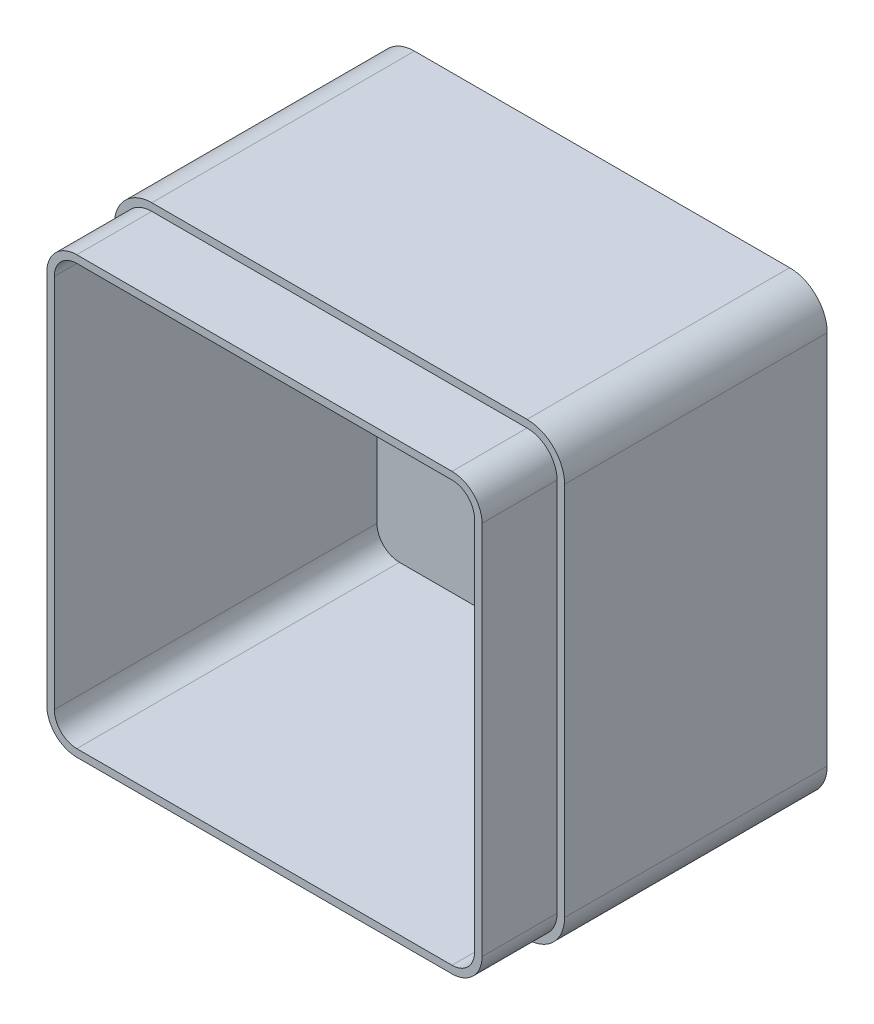
ISO-10303-21;
HEADER;
FILE_DESCRIPTION(('STEP AP214'),'2;1');
FILE_NAME('part.step','',(''),(''),'','','');
FILE_SCHEMA(('AUTOMOTIVE_DESIGN { 1 0 10303 214 1 1 1 1 }'));
ENDSEC;
DATA;
#1=APPLICATION_CONTEXT('core data for automotive mechanical design processes');
#2=APPLICATION_PROTOCOL_DEFINITION('international standard','automotive_design',2000,#1);
#3=PRODUCT_CONTEXT('',#1,'mechanical');
#4=PRODUCT('Part','Part','',(#3));
#5=PRODUCT_RELATED_PRODUCT_CATEGORY('part','',(#4));
#6=PRODUCT_DEFINITION_FORMATION('','',#4);
#7=PRODUCT_DEFINITION_CONTEXT('part definition',#1,'design');
#8=PRODUCT_DEFINITION('design','',#6,#7);
#9=PRODUCT_DEFINITION_SHAPE('','',#8);
#10=(LENGTH_UNIT() NAMED_UNIT(*) SI_UNIT(.MILLI.,.METRE.));
#11=(NAMED_UNIT(*) PLANE_ANGLE_UNIT() SI_UNIT($,.RADIAN.));
#12=(NAMED_UNIT(*) SI_UNIT($,.STERADIAN.) SOLID_ANGLE_UNIT());
#13=UNCERTAINTY_MEASURE_WITH_UNIT(LENGTH_MEASURE(1.E-05),#10,'distance_accuracy_value','');
#14=(GEOMETRIC_REPRESENTATION_CONTEXT(3) GLOBAL_UNCERTAINTY_ASSIGNED_CONTEXT((#13)) GLOBAL_UNIT_ASSIGNED_CONTEXT((#10,
#11,#12)) REPRESENTATION_CONTEXT('',''));
#15=CARTESIAN_POINT('',(0.,0.,0.));
#16=DIRECTION('',(0.,0.,1.));
#17=DIRECTION('',(1.,0.,0.));
#18=AXIS2_PLACEMENT_3D('',#15,#16,#17);
#19=CARTESIAN_POINT('',(0.,120.,90.));
#20=DIRECTION('',(0.,0.,-1.));
#21=DIRECTION('',(-1.,0.,0.));
#22=AXIS2_PLACEMENT_3D('',#19,#20,#21);
#23=PLANE('',#22);
#24=DIRECTION('',(0.,-1.,0.));
#25=VECTOR('',#24,1.);
#26=CARTESIAN_POINT('',(4.,120.,90.));
#27=LINE('',#26,#25);
#28=CARTESIAN_POINT('',(4.,110.,90.));
#29=VERTEX_POINT('',#28);
#30=CARTESIAN_POINT('',(4.,9.99999999999999,90.));
#31=VERTEX_POINT('',#30);
#32=EDGE_CURVE('E302',#29,#31,#27,.T.);
#33=ORIENTED_EDGE('',*,*,#32,.F.);
#34=CARTESIAN_POINT('',(10.,110.,90.));
#35=DIRECTION('',(0.,0.,-1.));
#36=DIRECTION('',(-1.,0.,0.));
#37=AXIS2_PLACEMENT_3D('',#34,#35,#36);
#38=CIRCLE('',#37,6.);
#39=CARTESIAN_POINT('',(9.99999999999999,116.,90.));
#40=VERTEX_POINT('',#39);
#41=EDGE_CURVE('E335',#40,#29,#38,.F.);
#42=ORIENTED_EDGE('',*,*,#41,.F.);
#43=DIRECTION('',(-1.,0.,0.));
#44=VECTOR('',#43,1.);
#45=CARTESIAN_POINT('',(0.,116.,90.));
#46=LINE('',#45,#44);
#47=CARTESIAN_POINT('',(110.,116.,90.));
#48=VERTEX_POINT('',#47);
#49=EDGE_CURVE('E312',#48,#40,#46,.T.);
#50=ORIENTED_EDGE('',*,*,#49,.F.);
#51=CARTESIAN_POINT('',(110.,110.,90.));
#52=DIRECTION('',(0.,0.,-1.));
#53=DIRECTION('',(-1.,0.,0.));
#54=AXIS2_PLACEMENT_3D('',#51,#52,#53);
#55=CIRCLE('',#54,6.);
#56=CARTESIAN_POINT('',(116.,110.,90.));
#57=VERTEX_POINT('',#56);
#58=EDGE_CURVE('E286',#57,#48,#55,.F.);
#59=ORIENTED_EDGE('',*,*,#58,.F.);
#60=DIRECTION('',(0.,1.,0.));
#61=VECTOR('',#60,1.);
#62=CARTESIAN_POINT('',(116.,120.,90.));
#63=LINE('',#62,#61);
#64=CARTESIAN_POINT('',(116.,9.99999999999999,90.));
#65=VERTEX_POINT('',#64);
#66=EDGE_CURVE('E333',#65,#57,#63,.T.);
#67=ORIENTED_EDGE('',*,*,#66,.F.);
#68=CARTESIAN_POINT('',(110.,10.,90.));
#69=DIRECTION('',(0.,0.,-1.));
#70=DIRECTION('',(-1.,0.,0.));
#71=AXIS2_PLACEMENT_3D('',#68,#69,#70);
#72=CIRCLE('',#71,6.);
#73=CARTESIAN_POINT('',(110.,4.,90.));
#74=VERTEX_POINT('',#73);
#75=EDGE_CURVE('E330',#74,#65,#72,.F.);
#76=ORIENTED_EDGE('',*,*,#75,.F.);
#77=DIRECTION('',(1.,0.,0.));
#78=VECTOR('',#77,1.);
#79=CARTESIAN_POINT('',(0.,4.,90.));
#80=LINE('',#79,#78);
#81=CARTESIAN_POINT('',(9.99999999999999,4.,90.));
#82=VERTEX_POINT('',#81);
#83=EDGE_CURVE('E328',#82,#74,#80,.T.);
#84=ORIENTED_EDGE('',*,*,#83,.F.);
#85=CARTESIAN_POINT('',(10.,10.,90.));
#86=DIRECTION('',(0.,0.,-1.));
#87=DIRECTION('',(-1.,0.,0.));
#88=AXIS2_PLACEMENT_3D('',#85,#86,#87);
#89=CIRCLE('',#88,6.);
#90=EDGE_CURVE('E319',#31,#82,#89,.F.);
#91=ORIENTED_EDGE('',*,*,#90,.F.);
#92=EDGE_LOOP('',(#33,#42,#50,#59,#67,#76,#84,#91));
#93=FACE_BOUND('',#92,.T.);
#94=CARTESIAN_POINT('',(110.,110.,90.));
#95=DIRECTION('',(0.,0.,1.));
#96=DIRECTION('',(1.,0.,0.));
#97=AXIS2_PLACEMENT_3D('',#94,#95,#96);
#98=CIRCLE('',#97,8.);
#99=CARTESIAN_POINT('',(118.,110.,90.));
#100=VERTEX_POINT('',#99);
#101=CARTESIAN_POINT('',(110.,118.,90.));
#102=VERTEX_POINT('',#101);
#103=EDGE_CURVE('E238',#100,#102,#98,.T.);
#104=ORIENTED_EDGE('',*,*,#103,.T.);
#105=DIRECTION('',(-1.,0.,0.));
#106=VECTOR('',#105,1.);
#107=CARTESIAN_POINT('',(110.,118.,90.));
#108=LINE('',#107,#106);
#109=CARTESIAN_POINT('',(9.99999999999999,118.,90.));
#110=VERTEX_POINT('',#109);
#111=EDGE_CURVE('E198',#102,#110,#108,.T.);
#112=ORIENTED_EDGE('',*,*,#111,.T.);
#113=CARTESIAN_POINT('',(10.,110.,90.));
#114=DIRECTION('',(0.,0.,1.));
#115=DIRECTION('',(1.,0.,0.));
#116=AXIS2_PLACEMENT_3D('',#113,#114,#115);
#117=CIRCLE('',#116,7.99999999999999);
#118=CARTESIAN_POINT('',(2.,110.,90.));
#119=VERTEX_POINT('',#118);
#120=EDGE_CURVE('E46',#110,#119,#117,.T.);
#121=ORIENTED_EDGE('',*,*,#120,.T.);
#122=DIRECTION('',(0.,-1.,0.));
#123=VECTOR('',#122,1.);
#124=CARTESIAN_POINT('',(2.,110.,90.));
#125=LINE('',#124,#123);
#126=CARTESIAN_POINT('',(2.00000000000001,9.99999999999999,90.));
#127=VERTEX_POINT('',#126);
#128=EDGE_CURVE('E242',#119,#127,#125,.T.);
#129=ORIENTED_EDGE('',*,*,#128,.T.);
#130=CARTESIAN_POINT('',(10.,10.,90.));
#131=DIRECTION('',(0.,0.,1.));
#132=DIRECTION('',(1.,0.,0.));
#133=AXIS2_PLACEMENT_3D('',#130,#131,#132);
#134=CIRCLE('',#133,7.99999999999999);
#135=CARTESIAN_POINT('',(9.99999999999999,2.00000000000001,90.));
#136=VERTEX_POINT('',#135);
#137=EDGE_CURVE('E245',#127,#136,#134,.T.);
#138=ORIENTED_EDGE('',*,*,#137,.T.);
#139=DIRECTION('',(1.,0.,0.));
#140=VECTOR('',#139,1.);
#141=CARTESIAN_POINT('',(9.99999999999999,2.,90.));
#142=LINE('',#141,#140);
#143=CARTESIAN_POINT('',(110.,2.00000000000001,90.));
#144=VERTEX_POINT('',#143);
#145=EDGE_CURVE('E248',#136,#144,#142,.T.);
#146=ORIENTED_EDGE('',*,*,#145,.T.);
#147=CARTESIAN_POINT('',(110.,10.,90.));
#148=DIRECTION('',(0.,0.,1.));
#149=DIRECTION('',(1.,0.,0.));
#150=AXIS2_PLACEMENT_3D('',#147,#148,#149);
#151=CIRCLE('',#150,7.99999999999999);
#152=CARTESIAN_POINT('',(118.,10.,90.));
#153=VERTEX_POINT('',#152);
#154=EDGE_CURVE('E221',#144,#153,#151,.T.);
#155=ORIENTED_EDGE('',*,*,#154,.T.);
#156=DIRECTION('',(0.,1.,0.));
#157=VECTOR('',#156,1.);
#158=CARTESIAN_POINT('',(118.,9.99999999999999,90.));
#159=LINE('',#158,#157);
#160=EDGE_CURVE('E218',#153,#100,#159,.T.);
#161=ORIENTED_EDGE('',*,*,#160,.T.);
#162=EDGE_LOOP('',(#104,#112,#121,#129,#138,#146,#155,#161));
#163=FACE_BOUND('',#162,.T.);
#164=ADVANCED_FACE('F31',(#93,#163),#23,.F.);
#165=CARTESIAN_POINT('',(4.,0.,90.));
#166=DIRECTION('',(1.,0.,0.));
#167=DIRECTION('',(0.,0.,-1.));
#168=AXIS2_PLACEMENT_3D('',#165,#166,#167);
#169=PLANE('',#168);
#170=DIRECTION('',(0.,-1.,0.));
#171=VECTOR('',#170,1.);
#172=CARTESIAN_POINT('',(4.,120.,4.));
#173=LINE('',#172,#171);
#174=CARTESIAN_POINT('',(4.,110.,4.));
#175=VERTEX_POINT('',#174);
#176=CARTESIAN_POINT('',(4.,9.99999999999999,4.));
#177=VERTEX_POINT('',#176);
#178=EDGE_CURVE('E280',#175,#177,#173,.T.);
#179=ORIENTED_EDGE('',*,*,#178,.F.);
#180=DIRECTION('',(0.,0.,-1.));
#181=VECTOR('',#180,1.);
#182=CARTESIAN_POINT('',(4.,110.,90.));
#183=LINE('',#182,#181);
#184=EDGE_CURVE('E287',#29,#175,#183,.T.);
#185=ORIENTED_EDGE('',*,*,#184,.F.);
#186=ORIENTED_EDGE('',*,*,#32,.T.);
#187=DIRECTION('',(0.,0.,-1.));
#188=VECTOR('',#187,1.);
#189=CARTESIAN_POINT('',(4.,9.99999999999999,90.));
#190=LINE('',#189,#188);
#191=EDGE_CURVE('E284',#177,#31,#190,.F.);
#192=ORIENTED_EDGE('',*,*,#191,.F.);
#193=EDGE_LOOP('',(#179,#185,#186,#192));
#194=FACE_BOUND('',#193,.T.);
#195=ADVANCED_FACE('F424',(#194),#169,.T.);
#196=CARTESIAN_POINT('',(0.,4.,90.));
#197=DIRECTION('',(0.,1.,0.));
#198=DIRECTION('',(0.,0.,1.));
#199=AXIS2_PLACEMENT_3D('',#196,#197,#198);
#200=PLANE('',#199);
#201=ORIENTED_EDGE('',*,*,#83,.T.);
#202=DIRECTION('',(0.,0.,1.));
#203=VECTOR('',#202,1.);
#204=CARTESIAN_POINT('',(110.,4.,90.));
#205=LINE('',#204,#203);
#206=CARTESIAN_POINT('',(110.,4.,4.));
#207=VERTEX_POINT('',#206);
#208=EDGE_CURVE('E310',#207,#74,#205,.T.);
#209=ORIENTED_EDGE('',*,*,#208,.F.);
#210=DIRECTION('',(1.,0.,0.));
#211=VECTOR('',#210,1.);
#212=CARTESIAN_POINT('',(0.,4.,4.));
#213=LINE('',#212,#211);
#214=CARTESIAN_POINT('',(9.99999999999999,4.,4.));
#215=VERTEX_POINT('',#214);
#216=EDGE_CURVE('E283',#215,#207,#213,.T.);
#217=ORIENTED_EDGE('',*,*,#216,.F.);
#218=DIRECTION('',(0.,0.,1.));
#219=VECTOR('',#218,1.);
#220=CARTESIAN_POINT('',(9.99999999999999,4.,90.));
#221=LINE('',#220,#219);
#222=EDGE_CURVE('E304',#82,#215,#221,.F.);
#223=ORIENTED_EDGE('',*,*,#222,.F.);
#224=EDGE_LOOP('',(#201,#209,#217,#223));
#225=FACE_BOUND('',#224,.T.);
#226=ADVANCED_FACE('F430',(#225),#200,.T.);
#227=CARTESIAN_POINT('',(116.,0.,90.));
#228=DIRECTION('',(-1.,0.,0.));
#229=DIRECTION('',(0.,0.,1.));
#230=AXIS2_PLACEMENT_3D('',#227,#228,#229);
#231=PLANE('',#230);
#232=ORIENTED_EDGE('',*,*,#66,.T.);
#233=DIRECTION('',(0.,0.,1.));
#234=VECTOR('',#233,1.);
#235=CARTESIAN_POINT('',(116.,110.,90.));
#236=LINE('',#235,#234);
#237=CARTESIAN_POINT('',(116.,110.,4.));
#238=VERTEX_POINT('',#237);
#239=EDGE_CURVE('E317',#238,#57,#236,.T.);
#240=ORIENTED_EDGE('',*,*,#239,.F.);
#241=DIRECTION('',(0.,1.,0.));
#242=VECTOR('',#241,1.);
#243=CARTESIAN_POINT('',(116.,120.,4.));
#244=LINE('',#243,#242);
#245=CARTESIAN_POINT('',(116.,9.99999999999999,4.));
#246=VERTEX_POINT('',#245);
#247=EDGE_CURVE('E293',#246,#238,#244,.T.);
#248=ORIENTED_EDGE('',*,*,#247,.F.);
#249=DIRECTION('',(0.,0.,1.));
#250=VECTOR('',#249,1.);
#251=CARTESIAN_POINT('',(116.,9.99999999999999,90.));
#252=LINE('',#251,#250);
#253=EDGE_CURVE('E313',#65,#246,#252,.F.);
#254=ORIENTED_EDGE('',*,*,#253,.F.);
#255=EDGE_LOOP('',(#232,#240,#248,#254));
#256=FACE_BOUND('',#255,.T.);
#257=ADVANCED_FACE('F620',(#256),#231,.T.);
#258=CARTESIAN_POINT('',(0.,116.,90.));
#259=DIRECTION('',(0.,-1.,0.));
#260=DIRECTION('',(0.,0.,-1.));
#261=AXIS2_PLACEMENT_3D('',#258,#259,#260);
#262=PLANE('',#261);
#263=DIRECTION('',(-1.,0.,0.));
#264=VECTOR('',#263,1.);
#265=CARTESIAN_POINT('',(0.,116.,4.));
#266=LINE('',#265,#264);
#267=CARTESIAN_POINT('',(110.,116.,4.));
#268=VERTEX_POINT('',#267);
#269=CARTESIAN_POINT('',(9.99999999999999,116.,4.));
#270=VERTEX_POINT('',#269);
#271=EDGE_CURVE('E299',#268,#270,#266,.T.);
#272=ORIENTED_EDGE('',*,*,#271,.F.);
#273=DIRECTION('',(0.,0.,-1.));
#274=VECTOR('',#273,1.);
#275=CARTESIAN_POINT('',(110.,116.,90.));
#276=LINE('',#275,#274);
#277=EDGE_CURVE('E316',#48,#268,#276,.T.);
#278=ORIENTED_EDGE('',*,*,#277,.F.);
#279=ORIENTED_EDGE('',*,*,#49,.T.);
#280=DIRECTION('',(0.,0.,-1.));
#281=VECTOR('',#280,1.);
#282=CARTESIAN_POINT('',(9.99999999999999,116.,90.));
#283=LINE('',#282,#281);
#284=EDGE_CURVE('E322',#270,#40,#283,.F.);
#285=ORIENTED_EDGE('',*,*,#284,.F.);
#286=EDGE_LOOP('',(#272,#278,#279,#285));
#287=FACE_BOUND('',#286,.T.);
#288=ADVANCED_FACE('F611',(#287),#262,.T.);
#289=CARTESIAN_POINT('',(0.,120.,4.));
#290=DIRECTION('',(0.,0.,-1.));
#291=DIRECTION('',(-1.,0.,0.));
#292=AXIS2_PLACEMENT_3D('',#289,#290,#291);
#293=PLANE('',#292);
#294=ORIENTED_EDGE('',*,*,#216,.T.);
#295=CARTESIAN_POINT('',(110.,10.,4.));
#296=DIRECTION('',(0.,0.,-1.));
#297=DIRECTION('',(-1.,0.,0.));
#298=AXIS2_PLACEMENT_3D('',#295,#296,#297);
#299=CIRCLE('',#298,6.);
#300=EDGE_CURVE('E295',#246,#207,#299,.T.);
#301=ORIENTED_EDGE('',*,*,#300,.F.);
#302=ORIENTED_EDGE('',*,*,#247,.T.);
#303=CARTESIAN_POINT('',(110.,110.,4.));
#304=DIRECTION('',(0.,0.,-1.));
#305=DIRECTION('',(-1.,0.,0.));
#306=AXIS2_PLACEMENT_3D('',#303,#304,#305);
#307=CIRCLE('',#306,6.);
#308=EDGE_CURVE('E298',#268,#238,#307,.T.);
#309=ORIENTED_EDGE('',*,*,#308,.F.);
#310=ORIENTED_EDGE('',*,*,#271,.T.);
#311=CARTESIAN_POINT('',(10.,110.,4.));
#312=DIRECTION('',(0.,0.,-1.));
#313=DIRECTION('',(-1.,0.,0.));
#314=AXIS2_PLACEMENT_3D('',#311,#312,#313);
#315=CIRCLE('',#314,6.);
#316=EDGE_CURVE('E296',#175,#270,#315,.T.);
#317=ORIENTED_EDGE('',*,*,#316,.F.);
#318=ORIENTED_EDGE('',*,*,#178,.T.);
#319=CARTESIAN_POINT('',(10.,10.,4.));
#320=DIRECTION('',(0.,0.,-1.));
#321=DIRECTION('',(-1.,0.,0.));
#322=AXIS2_PLACEMENT_3D('',#319,#320,#321);
#323=CIRCLE('',#322,6.);
#324=EDGE_CURVE('E290',#215,#177,#323,.T.);
#325=ORIENTED_EDGE('',*,*,#324,.F.);
#326=EDGE_LOOP('',(#294,#301,#302,#309,#310,#317,#318,#325));
#327=FACE_BOUND('',#326,.T.);
#328=ADVANCED_FACE('F602',(#327),#293,.F.);
#329=CARTESIAN_POINT('',(10.,10.,90.));
#330=DIRECTION('',(0.,0.,-1.));
#331=DIRECTION('',(-1.,0.,0.));
#332=AXIS2_PLACEMENT_3D('',#329,#330,#331);
#333=CYLINDRICAL_SURFACE('',#332,6.);
#334=ORIENTED_EDGE('',*,*,#90,.T.);
#335=ORIENTED_EDGE('',*,*,#222,.T.);
#336=ORIENTED_EDGE('',*,*,#324,.T.);
#337=ORIENTED_EDGE('',*,*,#191,.T.);
#338=EDGE_LOOP('',(#334,#335,#336,#337));
#339=FACE_BOUND('',#338,.T.);
#340=ADVANCED_FACE('F593',(#339),#333,.F.);
#341=CARTESIAN_POINT('',(110.,10.,90.));
#342=DIRECTION('',(0.,0.,-1.));
#343=DIRECTION('',(-1.,0.,0.));
#344=AXIS2_PLACEMENT_3D('',#341,#342,#343);
#345=CYLINDRICAL_SURFACE('',#344,6.);
#346=ORIENTED_EDGE('',*,*,#75,.T.);
#347=ORIENTED_EDGE('',*,*,#253,.T.);
#348=ORIENTED_EDGE('',*,*,#300,.T.);
#349=ORIENTED_EDGE('',*,*,#208,.T.);
#350=EDGE_LOOP('',(#346,#347,#348,#349));
#351=FACE_BOUND('',#350,.T.);
#352=ADVANCED_FACE('F585',(#351),#345,.F.);
#353=CARTESIAN_POINT('',(10.,110.,90.));
#354=DIRECTION('',(0.,0.,-1.));
#355=DIRECTION('',(-1.,0.,0.));
#356=AXIS2_PLACEMENT_3D('',#353,#354,#355);
#357=CYLINDRICAL_SURFACE('',#356,6.);
#358=ORIENTED_EDGE('',*,*,#41,.T.);
#359=ORIENTED_EDGE('',*,*,#184,.T.);
#360=ORIENTED_EDGE('',*,*,#316,.T.);
#361=ORIENTED_EDGE('',*,*,#284,.T.);
#362=EDGE_LOOP('',(#358,#359,#360,#361));
#363=FACE_BOUND('',#362,.T.);
#364=ADVANCED_FACE('F577',(#363),#357,.F.);
#365=CARTESIAN_POINT('',(110.,110.,90.));
#366=DIRECTION('',(0.,0.,-1.));
#367=DIRECTION('',(-1.,0.,0.));
#368=AXIS2_PLACEMENT_3D('',#365,#366,#367);
#369=CYLINDRICAL_SURFACE('',#368,6.);
#370=ORIENTED_EDGE('',*,*,#58,.T.);
#371=ORIENTED_EDGE('',*,*,#277,.T.);
#372=ORIENTED_EDGE('',*,*,#308,.T.);
#373=ORIENTED_EDGE('',*,*,#239,.T.);
#374=EDGE_LOOP('',(#370,#371,#372,#373));
#375=FACE_BOUND('',#374,.T.);
#376=ADVANCED_FACE('F437',(#375),#369,.F.);
#377=CARTESIAN_POINT('',(10.,110.,70.));
#378=DIRECTION('',(0.,0.,1.));
#379=DIRECTION('',(1.,0.,0.));
#380=AXIS2_PLACEMENT_3D('',#377,#378,#379);
#381=PLANE('',#380);
#382=DIRECTION('',(0.,1.,0.));
#383=VECTOR('',#382,1.);
#384=CARTESIAN_POINT('',(118.,9.99999999999999,70.));
#385=LINE('',#384,#383);
#386=CARTESIAN_POINT('',(118.,10.,70.));
#387=VERTEX_POINT('',#386);
#388=CARTESIAN_POINT('',(118.,110.,70.));
#389=VERTEX_POINT('',#388);
#390=EDGE_CURVE('E204',#387,#389,#385,.T.);
#391=ORIENTED_EDGE('',*,*,#390,.F.);
#392=CARTESIAN_POINT('',(110.,10.,70.));
#393=DIRECTION('',(0.,0.,1.));
#394=DIRECTION('',(1.,0.,0.));
#395=AXIS2_PLACEMENT_3D('',#392,#393,#394);
#396=CIRCLE('',#395,7.99999999999999);
#397=CARTESIAN_POINT('',(110.,2.00000000000001,70.));
#398=VERTEX_POINT('',#397);
#399=EDGE_CURVE('E234',#398,#387,#396,.T.);
#400=ORIENTED_EDGE('',*,*,#399,.F.);
#401=DIRECTION('',(1.,0.,0.));
#402=VECTOR('',#401,1.);
#403=CARTESIAN_POINT('',(9.99999999999999,2.,70.));
#404=LINE('',#403,#402);
#405=CARTESIAN_POINT('',(9.99999999999999,2.00000000000001,70.));
#406=VERTEX_POINT('',#405);
#407=EDGE_CURVE('E231',#406,#398,#404,.T.);
#408=ORIENTED_EDGE('',*,*,#407,.F.);
#409=CARTESIAN_POINT('',(10.,10.,70.));
#410=DIRECTION('',(0.,0.,1.));
#411=DIRECTION('',(1.,0.,0.));
#412=AXIS2_PLACEMENT_3D('',#409,#410,#411);
#413=CIRCLE('',#412,7.99999999999999);
#414=CARTESIAN_POINT('',(2.00000000000001,9.99999999999999,70.));
#415=VERTEX_POINT('',#414);
#416=EDGE_CURVE('E228',#415,#406,#413,.T.);
#417=ORIENTED_EDGE('',*,*,#416,.F.);
#418=DIRECTION('',(0.,-1.,0.));
#419=VECTOR('',#418,1.);
#420=CARTESIAN_POINT('',(2.,110.,70.));
#421=LINE('',#420,#419);
#422=CARTESIAN_POINT('',(2.,110.,70.));
#423=VERTEX_POINT('',#422);
#424=EDGE_CURVE('E225',#423,#415,#421,.T.);
#425=ORIENTED_EDGE('',*,*,#424,.F.);
#426=CARTESIAN_POINT('',(10.,110.,70.));
#427=DIRECTION('',(0.,0.,1.));
#428=DIRECTION('',(1.,0.,0.));
#429=AXIS2_PLACEMENT_3D('',#426,#427,#428);
#430=CIRCLE('',#429,7.99999999999999);
#431=CARTESIAN_POINT('',(9.99999999999999,118.,70.));
#432=VERTEX_POINT('',#431);
#433=EDGE_CURVE('E214',#432,#423,#430,.T.);
#434=ORIENTED_EDGE('',*,*,#433,.F.);
#435=DIRECTION('',(-1.,0.,0.));
#436=VECTOR('',#435,1.);
#437=CARTESIAN_POINT('',(110.,118.,70.));
#438=LINE('',#437,#436);
#439=CARTESIAN_POINT('',(110.,118.,70.));
#440=VERTEX_POINT('',#439);
#441=EDGE_CURVE('E196',#440,#432,#438,.T.);
#442=ORIENTED_EDGE('',*,*,#441,.F.);
#443=CARTESIAN_POINT('',(110.,110.,70.));
#444=DIRECTION('',(0.,0.,1.));
#445=DIRECTION('',(1.,0.,0.));
#446=AXIS2_PLACEMENT_3D('',#443,#444,#445);
#447=CIRCLE('',#446,8.);
#448=EDGE_CURVE('E210',#389,#440,#447,.T.);
#449=ORIENTED_EDGE('',*,*,#448,.F.);
#450=EDGE_LOOP('',(#391,#400,#408,#417,#425,#434,#442,#449));
#451=FACE_BOUND('',#450,.T.);
#452=CARTESIAN_POINT('',(10.,110.,70.));
#453=DIRECTION('',(0.,0.,1.));
#454=DIRECTION('',(1.,0.,0.));
#455=AXIS2_PLACEMENT_3D('',#452,#453,#454);
#456=CIRCLE('',#455,10.);
#457=CARTESIAN_POINT('',(10.,120.,70.));
#458=VERTEX_POINT('',#457);
#459=CARTESIAN_POINT('',(0.,110.,70.));
#460=VERTEX_POINT('',#459);
#461=EDGE_CURVE('E254',#458,#460,#456,.T.);
#462=ORIENTED_EDGE('',*,*,#461,.T.);
#463=DIRECTION('',(0.,-1.,0.));
#464=VECTOR('',#463,1.);
#465=CARTESIAN_POINT('',(0.,110.,70.));
#466=LINE('',#465,#464);
#467=CARTESIAN_POINT('',(0.,10.,70.));
#468=VERTEX_POINT('',#467);
#469=EDGE_CURVE('E267',#460,#468,#466,.T.);
#470=ORIENTED_EDGE('',*,*,#469,.T.);
#471=CARTESIAN_POINT('',(10.,10.,70.));
#472=DIRECTION('',(0.,0.,1.));
#473=DIRECTION('',(1.,0.,0.));
#474=AXIS2_PLACEMENT_3D('',#471,#472,#473);
#475=CIRCLE('',#474,10.);
#476=CARTESIAN_POINT('',(9.99999999999999,0.,70.));
#477=VERTEX_POINT('',#476);
#478=EDGE_CURVE('E269',#468,#477,#475,.T.);
#479=ORIENTED_EDGE('',*,*,#478,.T.);
#480=DIRECTION('',(1.,0.,0.));
#481=VECTOR('',#480,1.);
#482=CARTESIAN_POINT('',(9.99999999999999,0.,70.));
#483=LINE('',#482,#481);
#484=CARTESIAN_POINT('',(110.,0.,70.));
#485=VERTEX_POINT('',#484);
#486=EDGE_CURVE('E271',#477,#485,#483,.T.);
#487=ORIENTED_EDGE('',*,*,#486,.T.);
#488=CARTESIAN_POINT('',(110.,10.,70.));
#489=DIRECTION('',(0.,0.,1.));
#490=DIRECTION('',(1.,0.,0.));
#491=AXIS2_PLACEMENT_3D('',#488,#489,#490);
#492=CIRCLE('',#491,9.99999999999999);
#493=CARTESIAN_POINT('',(120.,10.,70.));
#494=VERTEX_POINT('',#493);
#495=EDGE_CURVE('E273',#485,#494,#492,.T.);
#496=ORIENTED_EDGE('',*,*,#495,.T.);
#497=DIRECTION('',(0.,1.,0.));
#498=VECTOR('',#497,1.);
#499=CARTESIAN_POINT('',(120.,10.,70.));
#500=LINE('',#499,#498);
#501=CARTESIAN_POINT('',(120.,110.,70.));
#502=VERTEX_POINT('',#501);
#503=EDGE_CURVE('E54',#494,#502,#500,.T.);
#504=ORIENTED_EDGE('',*,*,#503,.T.);
#505=CARTESIAN_POINT('',(110.,110.,70.));
#506=DIRECTION('',(0.,0.,1.));
#507=DIRECTION('',(1.,0.,0.));
#508=AXIS2_PLACEMENT_3D('',#505,#506,#507);
#509=CIRCLE('',#508,9.99999999999999);
#510=CARTESIAN_POINT('',(110.,120.,70.));
#511=VERTEX_POINT('',#510);
#512=EDGE_CURVE('E276',#502,#511,#509,.T.);
#513=ORIENTED_EDGE('',*,*,#512,.T.);
#514=DIRECTION('',(-1.,0.,0.));
#515=VECTOR('',#514,1.);
#516=CARTESIAN_POINT('',(110.,120.,70.));
#517=LINE('',#516,#515);
#518=EDGE_CURVE('E278',#511,#458,#517,.T.);
#519=ORIENTED_EDGE('',*,*,#518,.T.);
#520=EDGE_LOOP('',(#462,#470,#479,#487,#496,#504,#513,#519));
#521=FACE_BOUND('',#520,.T.);
#522=ADVANCED_FACE('F209',(#451,#521),#381,.T.);
#523=CARTESIAN_POINT('',(110.,110.,70.));
#524=DIRECTION('',(0.,0.,1.));
#525=DIRECTION('',(1.,0.,0.));
#526=AXIS2_PLACEMENT_3D('',#523,#524,#525);
#527=CYLINDRICAL_SURFACE('',#526,8.);
#528=ORIENTED_EDGE('',*,*,#103,.F.);
#529=DIRECTION('',(0.,0.,1.));
#530=VECTOR('',#529,1.);
#531=CARTESIAN_POINT('',(118.,110.,70.));
#532=LINE('',#531,#530);
#533=EDGE_CURVE('E217',#389,#100,#532,.T.);
#534=ORIENTED_EDGE('',*,*,#533,.F.);
#535=ORIENTED_EDGE('',*,*,#448,.T.);
#536=DIRECTION('',(0.,0.,1.));
#537=VECTOR('',#536,1.);
#538=CARTESIAN_POINT('',(110.,118.,70.));
#539=LINE('',#538,#537);
#540=EDGE_CURVE('E193',#440,#102,#539,.T.);
#541=ORIENTED_EDGE('',*,*,#540,.T.);
#542=EDGE_LOOP('',(#528,#534,#535,#541));
#543=FACE_BOUND('',#542,.T.);
#544=ADVANCED_FACE('F216',(#543),#527,.T.);
#545=CARTESIAN_POINT('',(118.,9.99999999999999,70.));
#546=DIRECTION('',(1.,0.,0.));
#547=DIRECTION('',(0.,0.,-1.));
#548=AXIS2_PLACEMENT_3D('',#545,#546,#547);
#549=PLANE('',#548);
#550=ORIENTED_EDGE('',*,*,#160,.F.);
#551=DIRECTION('',(0.,0.,1.));
#552=VECTOR('',#551,1.);
#553=CARTESIAN_POINT('',(118.,10.,70.));
#554=LINE('',#553,#552);
#555=EDGE_CURVE('E255',#387,#153,#554,.T.);
#556=ORIENTED_EDGE('',*,*,#555,.F.);
#557=ORIENTED_EDGE('',*,*,#390,.T.);
#558=ORIENTED_EDGE('',*,*,#533,.T.);
#559=EDGE_LOOP('',(#550,#556,#557,#558));
#560=FACE_BOUND('',#559,.T.);
#561=ADVANCED_FACE('F485',(#560),#549,.T.);
#562=CARTESIAN_POINT('',(110.,10.,70.));
#563=DIRECTION('',(0.,0.,1.));
#564=DIRECTION('',(1.,0.,0.));
#565=AXIS2_PLACEMENT_3D('',#562,#563,#564);
#566=CYLINDRICAL_SURFACE('',#565,7.99999999999999);
#567=ORIENTED_EDGE('',*,*,#154,.F.);
#568=DIRECTION('',(0.,0.,1.));
#569=VECTOR('',#568,1.);
#570=CARTESIAN_POINT('',(110.,2.00000000000001,70.));
#571=LINE('',#570,#569);
#572=EDGE_CURVE('E257',#398,#144,#571,.T.);
#573=ORIENTED_EDGE('',*,*,#572,.F.);
#574=ORIENTED_EDGE('',*,*,#399,.T.);
#575=ORIENTED_EDGE('',*,*,#555,.T.);
#576=EDGE_LOOP('',(#567,#573,#574,#575));
#577=FACE_BOUND('',#576,.T.);
#578=ADVANCED_FACE('F493',(#577),#566,.T.);
#579=CARTESIAN_POINT('',(9.99999999999999,2.,70.));
#580=DIRECTION('',(0.,-1.,0.));
#581=DIRECTION('',(1.,0.,0.));
#582=AXIS2_PLACEMENT_3D('',#579,#580,#581);
#583=PLANE('',#582);
#584=ORIENTED_EDGE('',*,*,#145,.F.);
#585=DIRECTION('',(0.,0.,1.));
#586=VECTOR('',#585,1.);
#587=CARTESIAN_POINT('',(9.99999999999999,2.00000000000001,70.));
#588=LINE('',#587,#586);
#589=EDGE_CURVE('E259',#406,#136,#588,.T.);
#590=ORIENTED_EDGE('',*,*,#589,.F.);
#591=ORIENTED_EDGE('',*,*,#407,.T.);
#592=ORIENTED_EDGE('',*,*,#572,.T.);
#593=EDGE_LOOP('',(#584,#590,#591,#592));
#594=FACE_BOUND('',#593,.T.);
#595=ADVANCED_FACE('F502',(#594),#583,.T.);
#596=CARTESIAN_POINT('',(10.,10.,70.));
#597=DIRECTION('',(0.,0.,1.));
#598=DIRECTION('',(1.,0.,0.));
#599=AXIS2_PLACEMENT_3D('',#596,#597,#598);
#600=CYLINDRICAL_SURFACE('',#599,7.99999999999999);
#601=ORIENTED_EDGE('',*,*,#137,.F.);
#602=DIRECTION('',(0.,0.,1.));
#603=VECTOR('',#602,1.);
#604=CARTESIAN_POINT('',(2.00000000000001,9.99999999999999,70.));
#605=LINE('',#604,#603);
#606=EDGE_CURVE('E261',#415,#127,#605,.T.);
#607=ORIENTED_EDGE('',*,*,#606,.F.);
#608=ORIENTED_EDGE('',*,*,#416,.T.);
#609=ORIENTED_EDGE('',*,*,#589,.T.);
#610=EDGE_LOOP('',(#601,#607,#608,#609));
#611=FACE_BOUND('',#610,.T.);
#612=ADVANCED_FACE('F511',(#611),#600,.T.);
#613=CARTESIAN_POINT('',(2.,110.,70.));
#614=DIRECTION('',(-1.,0.,0.));
#615=DIRECTION('',(0.,-1.,0.));
#616=AXIS2_PLACEMENT_3D('',#613,#614,#615);
#617=PLANE('',#616);
#618=ORIENTED_EDGE('',*,*,#128,.F.);
#619=DIRECTION('',(0.,0.,1.));
#620=VECTOR('',#619,1.);
#621=CARTESIAN_POINT('',(2.,110.,70.));
#622=LINE('',#621,#620);
#623=EDGE_CURVE('E263',#423,#119,#622,.T.);
#624=ORIENTED_EDGE('',*,*,#623,.F.);
#625=ORIENTED_EDGE('',*,*,#424,.T.);
#626=ORIENTED_EDGE('',*,*,#606,.T.);
#627=EDGE_LOOP('',(#618,#624,#625,#626));
#628=FACE_BOUND('',#627,.T.);
#629=ADVANCED_FACE('F520',(#628),#617,.T.);
#630=CARTESIAN_POINT('',(10.,110.,70.));
#631=DIRECTION('',(0.,0.,1.));
#632=DIRECTION('',(1.,0.,0.));
#633=AXIS2_PLACEMENT_3D('',#630,#631,#632);
#634=CYLINDRICAL_SURFACE('',#633,7.99999999999999);
#635=ORIENTED_EDGE('',*,*,#120,.F.);
#636=DIRECTION('',(0.,0.,1.));
#637=VECTOR('',#636,1.);
#638=CARTESIAN_POINT('',(9.99999999999999,118.,70.));
#639=LINE('',#638,#637);
#640=EDGE_CURVE('E203',#432,#110,#639,.T.);
#641=ORIENTED_EDGE('',*,*,#640,.F.);
#642=ORIENTED_EDGE('',*,*,#433,.T.);
#643=ORIENTED_EDGE('',*,*,#623,.T.);
#644=EDGE_LOOP('',(#635,#641,#642,#643));
#645=FACE_BOUND('',#644,.T.);
#646=ADVANCED_FACE('F529',(#645),#634,.T.);
#647=CARTESIAN_POINT('',(110.,118.,70.));
#648=DIRECTION('',(0.,1.,0.));
#649=DIRECTION('',(-1.,0.,0.));
#650=AXIS2_PLACEMENT_3D('',#647,#648,#649);
#651=PLANE('',#650);
#652=ORIENTED_EDGE('',*,*,#111,.F.);
#653=ORIENTED_EDGE('',*,*,#540,.F.);
#654=ORIENTED_EDGE('',*,*,#441,.T.);
#655=ORIENTED_EDGE('',*,*,#640,.T.);
#656=EDGE_LOOP('',(#652,#653,#654,#655));
#657=FACE_BOUND('',#656,.T.);
#658=ADVANCED_FACE('F195',(#657),#651,.T.);
#659=CARTESIAN_POINT('',(0.,120.,0.));
#660=DIRECTION('',(0.,0.,-1.));
#661=DIRECTION('',(-1.,0.,0.));
#662=AXIS2_PLACEMENT_3D('',#659,#660,#661);
#663=PLANE('',#662);
#664=DIRECTION('',(1.,0.,0.));
#665=VECTOR('',#664,1.);
#666=CARTESIAN_POINT('',(0.,0.,0.));
#667=LINE('',#666,#665);
#668=CARTESIAN_POINT('',(10.,0.,0.));
#669=VERTEX_POINT('',#668);
#670=CARTESIAN_POINT('',(110.,0.,0.));
#671=VERTEX_POINT('',#670);
#672=EDGE_CURVE('E343',#669,#671,#667,.T.);
#673=ORIENTED_EDGE('',*,*,#672,.F.);
#674=CARTESIAN_POINT('',(10.,10.,0.));
#675=DIRECTION('',(0.,0.,-1.));
#676=DIRECTION('',(-1.,0.,0.));
#677=AXIS2_PLACEMENT_3D('',#674,#675,#676);
#678=CIRCLE('',#677,10.);
#679=CARTESIAN_POINT('',(0.,10.,0.));
#680=VERTEX_POINT('',#679);
#681=EDGE_CURVE('E363',#669,#680,#678,.T.);
#682=ORIENTED_EDGE('',*,*,#681,.T.);
#683=DIRECTION('',(0.,-1.,0.));
#684=VECTOR('',#683,1.);
#685=CARTESIAN_POINT('',(0.,0.,0.));
#686=LINE('',#685,#684);
#687=CARTESIAN_POINT('',(0.,110.,0.));
#688=VERTEX_POINT('',#687);
#689=EDGE_CURVE('E325',#688,#680,#686,.T.);
#690=ORIENTED_EDGE('',*,*,#689,.F.);
#691=CARTESIAN_POINT('',(10.,110.,0.));
#692=DIRECTION('',(0.,0.,-1.));
#693=DIRECTION('',(-1.,0.,0.));
#694=AXIS2_PLACEMENT_3D('',#691,#692,#693);
#695=CIRCLE('',#694,10.);
#696=CARTESIAN_POINT('',(10.,120.,0.));
#697=VERTEX_POINT('',#696);
#698=EDGE_CURVE('E359',#688,#697,#695,.T.);
#699=ORIENTED_EDGE('',*,*,#698,.T.);
#700=DIRECTION('',(-1.,0.,0.));
#701=VECTOR('',#700,1.);
#702=CARTESIAN_POINT('',(0.,120.,0.));
#703=LINE('',#702,#701);
#704=CARTESIAN_POINT('',(110.,120.,0.));
#705=VERTEX_POINT('',#704);
#706=EDGE_CURVE('E349',#705,#697,#703,.T.);
#707=ORIENTED_EDGE('',*,*,#706,.F.);
#708=CARTESIAN_POINT('',(110.,110.,0.));
#709=DIRECTION('',(0.,0.,-1.));
#710=DIRECTION('',(-1.,0.,0.));
#711=AXIS2_PLACEMENT_3D('',#708,#709,#710);
#712=CIRCLE('',#711,10.);
#713=CARTESIAN_POINT('',(120.,110.,0.));
#714=VERTEX_POINT('',#713);
#715=EDGE_CURVE('E357',#705,#714,#712,.T.);
#716=ORIENTED_EDGE('',*,*,#715,.T.);
#717=DIRECTION('',(0.,1.,0.));
#718=VECTOR('',#717,1.);
#719=CARTESIAN_POINT('',(120.,0.,0.));
#720=LINE('',#719,#718);
#721=CARTESIAN_POINT('',(120.,10.,0.));
#722=VERTEX_POINT('',#721);
#723=EDGE_CURVE('E346',#722,#714,#720,.T.);
#724=ORIENTED_EDGE('',*,*,#723,.F.);
#725=CARTESIAN_POINT('',(110.,10.,0.));
#726=DIRECTION('',(0.,0.,-1.));
#727=DIRECTION('',(-1.,0.,0.));
#728=AXIS2_PLACEMENT_3D('',#725,#726,#727);
#729=CIRCLE('',#728,10.);
#730=EDGE_CURVE('E361',#722,#671,#729,.T.);
#731=ORIENTED_EDGE('',*,*,#730,.T.);
#732=EDGE_LOOP('',(#673,#682,#690,#699,#707,#716,#724,#731));
#733=FACE_BOUND('',#732,.T.);
#734=ADVANCED_FACE('F386',(#733),#663,.T.);
#735=CARTESIAN_POINT('',(10.,110.,90.));
#736=DIRECTION('',(0.,0.,-1.));
#737=DIRECTION('',(-1.,0.,0.));
#738=AXIS2_PLACEMENT_3D('',#735,#736,#737);
#739=CYLINDRICAL_SURFACE('',#738,10.);
#740=DIRECTION('',(0.,0.,-1.));
#741=VECTOR('',#740,1.);
#742=CARTESIAN_POINT('',(0.,110.,90.));
#743=LINE('',#742,#741);
#744=EDGE_CURVE('E365',#460,#688,#743,.T.);
#745=ORIENTED_EDGE('',*,*,#744,.F.);
#746=ORIENTED_EDGE('',*,*,#461,.F.);
#747=DIRECTION('',(0.,0.,-1.));
#748=VECTOR('',#747,1.);
#749=CARTESIAN_POINT('',(10.,120.,90.));
#750=LINE('',#749,#748);
#751=EDGE_CURVE('E11',#697,#458,#750,.F.);
#752=ORIENTED_EDGE('',*,*,#751,.F.);
#753=ORIENTED_EDGE('',*,*,#698,.F.);
#754=EDGE_LOOP('',(#745,#746,#752,#753));
#755=FACE_BOUND('',#754,.T.);
#756=ADVANCED_FACE('F391',(#755),#739,.T.);
#757=CARTESIAN_POINT('',(110.,110.,90.));
#758=DIRECTION('',(0.,0.,-1.));
#759=DIRECTION('',(-1.,0.,0.));
#760=AXIS2_PLACEMENT_3D('',#757,#758,#759);
#761=CYLINDRICAL_SURFACE('',#760,10.);
#762=DIRECTION('',(0.,0.,-1.));
#763=VECTOR('',#762,1.);
#764=CARTESIAN_POINT('',(110.,120.,90.));
#765=LINE('',#764,#763);
#766=EDGE_CURVE('E39',#511,#705,#765,.T.);
#767=ORIENTED_EDGE('',*,*,#766,.F.);
#768=ORIENTED_EDGE('',*,*,#512,.F.);
#769=DIRECTION('',(0.,0.,-1.));
#770=VECTOR('',#769,1.);
#771=CARTESIAN_POINT('',(120.,110.,90.));
#772=LINE('',#771,#770);
#773=EDGE_CURVE('E370',#714,#502,#772,.F.);
#774=ORIENTED_EDGE('',*,*,#773,.F.);
#775=ORIENTED_EDGE('',*,*,#715,.F.);
#776=EDGE_LOOP('',(#767,#768,#774,#775));
#777=FACE_BOUND('',#776,.T.);
#778=ADVANCED_FACE('F33',(#777),#761,.T.);
#779=CARTESIAN_POINT('',(0.,120.,90.));
#780=DIRECTION('',(0.,-1.,0.));
#781=DIRECTION('',(0.,0.,-1.));
#782=AXIS2_PLACEMENT_3D('',#779,#780,#781);
#783=PLANE('',#782);
#784=ORIENTED_EDGE('',*,*,#518,.F.);
#785=ORIENTED_EDGE('',*,*,#766,.T.);
#786=ORIENTED_EDGE('',*,*,#706,.T.);
#787=ORIENTED_EDGE('',*,*,#751,.T.);
#788=EDGE_LOOP('',(#784,#785,#786,#787));
#789=FACE_BOUND('',#788,.T.);
#790=ADVANCED_FACE('F378',(#789),#783,.F.);
#791=CARTESIAN_POINT('',(110.,10.,90.));
#792=DIRECTION('',(0.,0.,-1.));
#793=DIRECTION('',(-1.,0.,0.));
#794=AXIS2_PLACEMENT_3D('',#791,#792,#793);
#795=CYLINDRICAL_SURFACE('',#794,10.);
#796=DIRECTION('',(0.,0.,-1.));
#797=VECTOR('',#796,1.);
#798=CARTESIAN_POINT('',(120.,10.,90.));
#799=LINE('',#798,#797);
#800=EDGE_CURVE('E373',#494,#722,#799,.T.);
#801=ORIENTED_EDGE('',*,*,#800,.F.);
#802=ORIENTED_EDGE('',*,*,#495,.F.);
#803=DIRECTION('',(0.,0.,-1.));
#804=VECTOR('',#803,1.);
#805=CARTESIAN_POINT('',(110.,0.,90.));
#806=LINE('',#805,#804);
#807=EDGE_CURVE('E352',#671,#485,#806,.F.);
#808=ORIENTED_EDGE('',*,*,#807,.F.);
#809=ORIENTED_EDGE('',*,*,#730,.F.);
#810=EDGE_LOOP('',(#801,#802,#808,#809));
#811=FACE_BOUND('',#810,.T.);
#812=ADVANCED_FACE('F410',(#811),#795,.T.);
#813=CARTESIAN_POINT('',(120.,0.,90.));
#814=DIRECTION('',(-1.,0.,0.));
#815=DIRECTION('',(0.,0.,1.));
#816=AXIS2_PLACEMENT_3D('',#813,#814,#815);
#817=PLANE('',#816);
#818=ORIENTED_EDGE('',*,*,#503,.F.);
#819=ORIENTED_EDGE('',*,*,#800,.T.);
#820=ORIENTED_EDGE('',*,*,#723,.T.);
#821=ORIENTED_EDGE('',*,*,#773,.T.);
#822=EDGE_LOOP('',(#818,#819,#820,#821));
#823=FACE_BOUND('',#822,.T.);
#824=ADVANCED_FACE('F412',(#823),#817,.F.);
#825=CARTESIAN_POINT('',(10.,10.,90.));
#826=DIRECTION('',(0.,0.,-1.));
#827=DIRECTION('',(-1.,0.,0.));
#828=AXIS2_PLACEMENT_3D('',#825,#826,#827);
#829=CYLINDRICAL_SURFACE('',#828,10.);
#830=DIRECTION('',(0.,0.,-1.));
#831=VECTOR('',#830,1.);
#832=CARTESIAN_POINT('',(10.,0.,90.));
#833=LINE('',#832,#831);
#834=EDGE_CURVE('E355',#477,#669,#833,.T.);
#835=ORIENTED_EDGE('',*,*,#834,.F.);
#836=ORIENTED_EDGE('',*,*,#478,.F.);
#837=DIRECTION('',(0.,0.,-1.));
#838=VECTOR('',#837,1.);
#839=CARTESIAN_POINT('',(0.,10.,90.));
#840=LINE('',#839,#838);
#841=EDGE_CURVE('E367',#680,#468,#840,.F.);
#842=ORIENTED_EDGE('',*,*,#841,.F.);
#843=ORIENTED_EDGE('',*,*,#681,.F.);
#844=EDGE_LOOP('',(#835,#836,#842,#843));
#845=FACE_BOUND('',#844,.T.);
#846=ADVANCED_FACE('F401',(#845),#829,.T.);
#847=CARTESIAN_POINT('',(0.,0.,90.));
#848=DIRECTION('',(0.,1.,0.));
#849=DIRECTION('',(0.,0.,1.));
#850=AXIS2_PLACEMENT_3D('',#847,#848,#849);
#851=PLANE('',#850);
#852=ORIENTED_EDGE('',*,*,#486,.F.);
#853=ORIENTED_EDGE('',*,*,#834,.T.);
#854=ORIENTED_EDGE('',*,*,#672,.T.);
#855=ORIENTED_EDGE('',*,*,#807,.T.);
#856=EDGE_LOOP('',(#852,#853,#854,#855));
#857=FACE_BOUND('',#856,.T.);
#858=ADVANCED_FACE('F405',(#857),#851,.F.);
#859=CARTESIAN_POINT('',(0.,0.,90.));
#860=DIRECTION('',(1.,0.,0.));
#861=DIRECTION('',(0.,0.,-1.));
#862=AXIS2_PLACEMENT_3D('',#859,#860,#861);
#863=PLANE('',#862);
#864=ORIENTED_EDGE('',*,*,#469,.F.);
#865=ORIENTED_EDGE('',*,*,#744,.T.);
#866=ORIENTED_EDGE('',*,*,#689,.T.);
#867=ORIENTED_EDGE('',*,*,#841,.T.);
#868=EDGE_LOOP('',(#864,#865,#866,#867));
#869=FACE_BOUND('',#868,.T.);
#870=ADVANCED_FACE('F396',(#869),#863,.F.);
#871=CLOSED_SHELL('',(#164,#195,#226,#257,#288,#328,#340,#352,#364,#376,#522,#544,#561,#578,
#595,#612,#629,#646,#658,#734,#756,#778,#790,#812,#824,#846,#858,#870));
#872=MANIFOLD_SOLID_BREP('B2',#871);
#873=ADVANCED_BREP_SHAPE_REPRESENTATION('',(#18,#872),#14);
#874=SHAPE_DEFINITION_REPRESENTATION(#9,#873);
ENDSEC;
END-ISO-10303-21;
